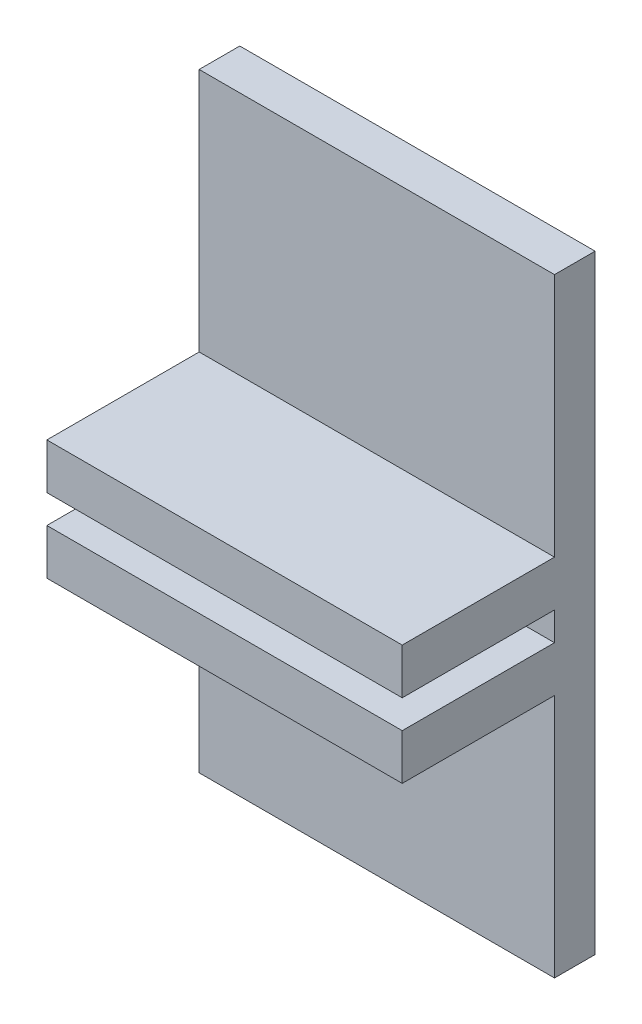
ISO-10303-21;
HEADER;
FILE_DESCRIPTION(('STEP AP214'),'2;1');
FILE_NAME('part.step','',(''),(''),'','','');
FILE_SCHEMA(('AUTOMOTIVE_DESIGN { 1 0 10303 214 1 1 1 1 }'));
ENDSEC;
DATA;
#1=APPLICATION_CONTEXT('core data for automotive mechanical design processes');
#2=APPLICATION_PROTOCOL_DEFINITION('international standard','automotive_design',2000,#1);
#3=PRODUCT_CONTEXT('',#1,'mechanical');
#4=PRODUCT('Part','Part','',(#3));
#5=PRODUCT_RELATED_PRODUCT_CATEGORY('part','',(#4));
#6=PRODUCT_DEFINITION_FORMATION('','',#4);
#7=PRODUCT_DEFINITION_CONTEXT('part definition',#1,'design');
#8=PRODUCT_DEFINITION('design','',#6,#7);
#9=PRODUCT_DEFINITION_SHAPE('','',#8);
#10=(LENGTH_UNIT() NAMED_UNIT(*) SI_UNIT(.MILLI.,.METRE.));
#11=(NAMED_UNIT(*) PLANE_ANGLE_UNIT() SI_UNIT($,.RADIAN.));
#12=(NAMED_UNIT(*) SI_UNIT($,.STERADIAN.) SOLID_ANGLE_UNIT());
#13=UNCERTAINTY_MEASURE_WITH_UNIT(LENGTH_MEASURE(1.E-05),#10,'distance_accuracy_value','');
#14=(GEOMETRIC_REPRESENTATION_CONTEXT(3) GLOBAL_UNCERTAINTY_ASSIGNED_CONTEXT((#13)) GLOBAL_UNIT_ASSIGNED_CONTEXT((#10,
#11,#12)) REPRESENTATION_CONTEXT('',''));
#15=CARTESIAN_POINT('',(0.,0.,0.));
#16=DIRECTION('',(0.,0.,1.));
#17=DIRECTION('',(1.,0.,0.));
#18=AXIS2_PLACEMENT_3D('',#15,#16,#17);
#19=CARTESIAN_POINT('',(-35.,11.8,8.));
#20=DIRECTION('',(0.,1.,0.));
#21=DIRECTION('',(1.,0.,0.));
#22=AXIS2_PLACEMENT_3D('',#19,#20,#21);
#23=PLANE('',#22);
#24=DIRECTION('',(1.,0.,0.));
#25=VECTOR('',#24,1.);
#26=CARTESIAN_POINT('',(-35.,11.8,8.));
#27=LINE('',#26,#25);
#28=CARTESIAN_POINT('',(-35.,11.8,8.));
#29=VERTEX_POINT('',#28);
#30=CARTESIAN_POINT('',(35.,11.8,8.));
#31=VERTEX_POINT('',#30);
#32=EDGE_CURVE('E169',#29,#31,#27,.T.);
#33=ORIENTED_EDGE('',*,*,#32,.F.);
#34=DIRECTION('',(0.,0.,1.));
#35=VECTOR('',#34,1.);
#36=CARTESIAN_POINT('',(-35.,11.8,8.));
#37=LINE('',#36,#35);
#38=CARTESIAN_POINT('',(-35.,11.8,38.));
#39=VERTEX_POINT('',#38);
#40=EDGE_CURVE('E154',#29,#39,#37,.T.);
#41=ORIENTED_EDGE('',*,*,#40,.T.);
#42=DIRECTION('',(1.,0.,0.));
#43=VECTOR('',#42,1.);
#44=CARTESIAN_POINT('',(-35.,11.8,38.));
#45=LINE('',#44,#43);
#46=CARTESIAN_POINT('',(35.,11.8,38.));
#47=VERTEX_POINT('',#46);
#48=EDGE_CURVE('E9',#39,#47,#45,.T.);
#49=ORIENTED_EDGE('',*,*,#48,.T.);
#50=DIRECTION('',(0.,0.,1.));
#51=VECTOR('',#50,1.);
#52=CARTESIAN_POINT('',(35.,11.8,8.));
#53=LINE('',#52,#51);
#54=EDGE_CURVE('E155',#31,#47,#53,.T.);
#55=ORIENTED_EDGE('',*,*,#54,.F.);
#56=EDGE_LOOP('',(#33,#41,#49,#55));
#57=FACE_BOUND('',#56,.T.);
#58=ADVANCED_FACE('F14',(#57),#23,.T.);
#59=CARTESIAN_POINT('',(-35.,2.8,38.));
#60=DIRECTION('',(0.,0.,1.));
#61=DIRECTION('',(1.,0.,0.));
#62=AXIS2_PLACEMENT_3D('',#59,#60,#61);
#63=PLANE('',#62);
#64=DIRECTION('',(0.,1.,0.));
#65=VECTOR('',#64,1.);
#66=CARTESIAN_POINT('',(-35.,2.8,38.));
#67=LINE('',#66,#65);
#68=CARTESIAN_POINT('',(-35.,2.8,38.));
#69=VERTEX_POINT('',#68);
#70=EDGE_CURVE('E225',#69,#39,#67,.T.);
#71=ORIENTED_EDGE('',*,*,#70,.F.);
#72=DIRECTION('',(1.,0.,0.));
#73=VECTOR('',#72,1.);
#74=CARTESIAN_POINT('',(-35.,2.8,38.));
#75=LINE('',#74,#73);
#76=CARTESIAN_POINT('',(35.,2.8,38.));
#77=VERTEX_POINT('',#76);
#78=EDGE_CURVE('E25',#69,#77,#75,.T.);
#79=ORIENTED_EDGE('',*,*,#78,.T.);
#80=DIRECTION('',(0.,1.,0.));
#81=VECTOR('',#80,1.);
#82=CARTESIAN_POINT('',(35.,2.8,38.));
#83=LINE('',#82,#81);
#84=EDGE_CURVE('E159',#77,#47,#83,.T.);
#85=ORIENTED_EDGE('',*,*,#84,.T.);
#86=ORIENTED_EDGE('',*,*,#48,.F.);
#87=EDGE_LOOP('',(#71,#79,#85,#86));
#88=FACE_BOUND('',#87,.T.);
#89=ADVANCED_FACE('F336',(#88),#63,.T.);
#90=CARTESIAN_POINT('',(-35.,2.8,8.));
#91=DIRECTION('',(0.,1.,0.));
#92=DIRECTION('',(1.,0.,0.));
#93=AXIS2_PLACEMENT_3D('',#90,#91,#92);
#94=PLANE('',#93);
#95=DIRECTION('',(0.,0.,1.));
#96=VECTOR('',#95,1.);
#97=CARTESIAN_POINT('',(35.,2.8,8.));
#98=LINE('',#97,#96);
#99=CARTESIAN_POINT('',(35.,2.8,8.));
#100=VERTEX_POINT('',#99);
#101=EDGE_CURVE('E160',#100,#77,#98,.T.);
#102=ORIENTED_EDGE('',*,*,#101,.T.);
#103=ORIENTED_EDGE('',*,*,#78,.F.);
#104=DIRECTION('',(0.,0.,1.));
#105=VECTOR('',#104,1.);
#106=CARTESIAN_POINT('',(-35.,2.8,8.));
#107=LINE('',#106,#105);
#108=CARTESIAN_POINT('',(-35.,2.8,8.));
#109=VERTEX_POINT('',#108);
#110=EDGE_CURVE('E191',#109,#69,#107,.T.);
#111=ORIENTED_EDGE('',*,*,#110,.F.);
#112=DIRECTION('',(1.,0.,0.));
#113=VECTOR('',#112,1.);
#114=CARTESIAN_POINT('',(-35.,2.8,8.));
#115=LINE('',#114,#113);
#116=EDGE_CURVE('E173',#109,#100,#115,.T.);
#117=ORIENTED_EDGE('',*,*,#116,.T.);
#118=EDGE_LOOP('',(#102,#103,#111,#117));
#119=FACE_BOUND('',#118,.T.);
#120=ADVANCED_FACE('F297',(#119),#94,.F.);
#121=CARTESIAN_POINT('',(35.,-60.,0.));
#122=DIRECTION('',(1.,0.,0.));
#123=DIRECTION('',(0.,1.,0.));
#124=AXIS2_PLACEMENT_3D('',#121,#122,#123);
#125=PLANE('',#124);
#126=DIRECTION('',(0.,0.,1.));
#127=VECTOR('',#126,1.);
#128=CARTESIAN_POINT('',(35.,-60.,0.));
#129=LINE('',#128,#127);
#130=CARTESIAN_POINT('',(35.,-60.,0.));
#131=VERTEX_POINT('',#130);
#132=CARTESIAN_POINT('',(35.,-60.,8.));
#133=VERTEX_POINT('',#132);
#134=EDGE_CURVE('E122',#131,#133,#129,.T.);
#135=ORIENTED_EDGE('',*,*,#134,.F.);
#136=DIRECTION('',(0.,1.,0.));
#137=VECTOR('',#136,1.);
#138=CARTESIAN_POINT('',(35.,-60.,0.));
#139=LINE('',#138,#137);
#140=CARTESIAN_POINT('',(35.,60.,0.));
#141=VERTEX_POINT('',#140);
#142=EDGE_CURVE('E106',#131,#141,#139,.T.);
#143=ORIENTED_EDGE('',*,*,#142,.T.);
#144=DIRECTION('',(0.,0.,1.));
#145=VECTOR('',#144,1.);
#146=CARTESIAN_POINT('',(35.,60.,0.));
#147=LINE('',#146,#145);
#148=CARTESIAN_POINT('',(35.,60.,8.));
#149=VERTEX_POINT('',#148);
#150=EDGE_CURVE('E163',#141,#149,#147,.T.);
#151=ORIENTED_EDGE('',*,*,#150,.T.);
#152=DIRECTION('',(0.,1.,0.));
#153=VECTOR('',#152,1.);
#154=CARTESIAN_POINT('',(35.,-60.,8.));
#155=LINE('',#154,#153);
#156=EDGE_CURVE('E167',#31,#149,#155,.T.);
#157=ORIENTED_EDGE('',*,*,#156,.F.);
#158=ORIENTED_EDGE('',*,*,#54,.T.);
#159=ORIENTED_EDGE('',*,*,#84,.F.);
#160=ORIENTED_EDGE('',*,*,#101,.F.);
#161=DIRECTION('',(0.,1.,0.));
#162=VECTOR('',#161,1.);
#163=CARTESIAN_POINT('',(35.,-60.,8.));
#164=LINE('',#163,#162);
#165=CARTESIAN_POINT('',(35.,-2.8,8.));
#166=VERTEX_POINT('',#165);
#167=EDGE_CURVE('E170',#166,#100,#164,.T.);
#168=ORIENTED_EDGE('',*,*,#167,.F.);
#169=DIRECTION('',(0.,0.,1.));
#170=VECTOR('',#169,1.);
#171=CARTESIAN_POINT('',(35.,-2.8,8.));
#172=LINE('',#171,#170);
#173=CARTESIAN_POINT('',(35.,-2.8,38.));
#174=VERTEX_POINT('',#173);
#175=EDGE_CURVE('E144',#166,#174,#172,.T.);
#176=ORIENTED_EDGE('',*,*,#175,.T.);
#177=DIRECTION('',(0.,1.,0.));
#178=VECTOR('',#177,1.);
#179=CARTESIAN_POINT('',(35.,-11.8,38.));
#180=LINE('',#179,#178);
#181=CARTESIAN_POINT('',(35.,-11.8,38.));
#182=VERTEX_POINT('',#181);
#183=EDGE_CURVE('E212',#182,#174,#180,.T.);
#184=ORIENTED_EDGE('',*,*,#183,.F.);
#185=DIRECTION('',(0.,0.,1.));
#186=VECTOR('',#185,1.);
#187=CARTESIAN_POINT('',(35.,-11.8,8.));
#188=LINE('',#187,#186);
#189=CARTESIAN_POINT('',(35.,-11.8,8.));
#190=VERTEX_POINT('',#189);
#191=EDGE_CURVE('E202',#190,#182,#188,.T.);
#192=ORIENTED_EDGE('',*,*,#191,.F.);
#193=DIRECTION('',(0.,1.,0.));
#194=VECTOR('',#193,1.);
#195=CARTESIAN_POINT('',(35.,-60.,8.));
#196=LINE('',#195,#194);
#197=EDGE_CURVE('E131',#133,#190,#196,.T.);
#198=ORIENTED_EDGE('',*,*,#197,.F.);
#199=EDGE_LOOP('',(#135,#143,#151,#157,#158,#159,#160,#168,#176,#184,#192,#198));
#200=FACE_BOUND('',#199,.T.);
#201=ADVANCED_FACE('F129',(#200),#125,.T.);
#202=CARTESIAN_POINT('',(-35.,-60.,8.));
#203=DIRECTION('',(0.,0.,1.));
#204=DIRECTION('',(1.,0.,0.));
#205=AXIS2_PLACEMENT_3D('',#202,#203,#204);
#206=PLANE('',#205);
#207=DIRECTION('',(0.,1.,0.));
#208=VECTOR('',#207,1.);
#209=CARTESIAN_POINT('',(-35.,-60.,8.));
#210=LINE('',#209,#208);
#211=CARTESIAN_POINT('',(-35.,-60.,8.));
#212=VERTEX_POINT('',#211);
#213=CARTESIAN_POINT('',(-35.,-11.8,8.));
#214=VERTEX_POINT('',#213);
#215=EDGE_CURVE('E197',#212,#214,#210,.T.);
#216=ORIENTED_EDGE('',*,*,#215,.F.);
#217=DIRECTION('',(1.,0.,0.));
#218=VECTOR('',#217,1.);
#219=CARTESIAN_POINT('',(-35.,-60.,8.));
#220=LINE('',#219,#218);
#221=EDGE_CURVE('E127',#212,#133,#220,.T.);
#222=ORIENTED_EDGE('',*,*,#221,.T.);
#223=ORIENTED_EDGE('',*,*,#197,.T.);
#224=DIRECTION('',(1.,0.,0.));
#225=VECTOR('',#224,1.);
#226=CARTESIAN_POINT('',(-35.,-11.8,8.));
#227=LINE('',#226,#225);
#228=EDGE_CURVE('E198',#214,#190,#227,.T.);
#229=ORIENTED_EDGE('',*,*,#228,.F.);
#230=EDGE_LOOP('',(#216,#222,#223,#229));
#231=FACE_BOUND('',#230,.T.);
#232=ADVANCED_FACE('F329',(#231),#206,.T.);
#233=CARTESIAN_POINT('',(-35.,-11.8,8.));
#234=DIRECTION('',(0.,1.,0.));
#235=DIRECTION('',(1.,0.,0.));
#236=AXIS2_PLACEMENT_3D('',#233,#234,#235);
#237=PLANE('',#236);
#238=ORIENTED_EDGE('',*,*,#191,.T.);
#239=DIRECTION('',(1.,0.,0.));
#240=VECTOR('',#239,1.);
#241=CARTESIAN_POINT('',(-35.,-11.8,38.));
#242=LINE('',#241,#240);
#243=CARTESIAN_POINT('',(-35.,-11.8,38.));
#244=VERTEX_POINT('',#243);
#245=EDGE_CURVE('E147',#244,#182,#242,.T.);
#246=ORIENTED_EDGE('',*,*,#245,.F.);
#247=DIRECTION('',(0.,0.,1.));
#248=VECTOR('',#247,1.);
#249=CARTESIAN_POINT('',(-35.,-11.8,8.));
#250=LINE('',#249,#248);
#251=EDGE_CURVE('E193',#214,#244,#250,.T.);
#252=ORIENTED_EDGE('',*,*,#251,.F.);
#253=ORIENTED_EDGE('',*,*,#228,.T.);
#254=EDGE_LOOP('',(#238,#246,#252,#253));
#255=FACE_BOUND('',#254,.T.);
#256=ADVANCED_FACE('F274',(#255),#237,.F.);
#257=CARTESIAN_POINT('',(-35.,-11.8,38.));
#258=DIRECTION('',(0.,0.,1.));
#259=DIRECTION('',(1.,0.,0.));
#260=AXIS2_PLACEMENT_3D('',#257,#258,#259);
#261=PLANE('',#260);
#262=DIRECTION('',(0.,1.,0.));
#263=VECTOR('',#262,1.);
#264=CARTESIAN_POINT('',(-35.,-11.8,38.));
#265=LINE('',#264,#263);
#266=CARTESIAN_POINT('',(-35.,-2.8,38.));
#267=VERTEX_POINT('',#266);
#268=EDGE_CURVE('E196',#244,#267,#265,.T.);
#269=ORIENTED_EDGE('',*,*,#268,.F.);
#270=ORIENTED_EDGE('',*,*,#245,.T.);
#271=ORIENTED_EDGE('',*,*,#183,.T.);
#272=DIRECTION('',(1.,0.,0.));
#273=VECTOR('',#272,1.);
#274=CARTESIAN_POINT('',(-35.,-2.8,38.));
#275=LINE('',#274,#273);
#276=EDGE_CURVE('E148',#267,#174,#275,.T.);
#277=ORIENTED_EDGE('',*,*,#276,.F.);
#278=EDGE_LOOP('',(#269,#270,#271,#277));
#279=FACE_BOUND('',#278,.T.);
#280=ADVANCED_FACE('F278',(#279),#261,.T.);
#281=CARTESIAN_POINT('',(-35.,-2.8,8.));
#282=DIRECTION('',(0.,1.,0.));
#283=DIRECTION('',(1.,0.,0.));
#284=AXIS2_PLACEMENT_3D('',#281,#282,#283);
#285=PLANE('',#284);
#286=DIRECTION('',(1.,0.,0.));
#287=VECTOR('',#286,1.);
#288=CARTESIAN_POINT('',(-35.,-2.8,8.));
#289=LINE('',#288,#287);
#290=CARTESIAN_POINT('',(-35.,-2.8,8.));
#291=VERTEX_POINT('',#290);
#292=EDGE_CURVE('E165',#291,#166,#289,.T.);
#293=ORIENTED_EDGE('',*,*,#292,.F.);
#294=DIRECTION('',(0.,0.,1.));
#295=VECTOR('',#294,1.);
#296=CARTESIAN_POINT('',(-35.,-2.8,8.));
#297=LINE('',#296,#295);
#298=EDGE_CURVE('E18',#291,#267,#297,.T.);
#299=ORIENTED_EDGE('',*,*,#298,.T.);
#300=ORIENTED_EDGE('',*,*,#276,.T.);
#301=ORIENTED_EDGE('',*,*,#175,.F.);
#302=EDGE_LOOP('',(#293,#299,#300,#301));
#303=FACE_BOUND('',#302,.T.);
#304=ADVANCED_FACE('F16',(#303),#285,.T.);
#305=CARTESIAN_POINT('',(-35.,-60.,8.));
#306=DIRECTION('',(0.,0.,1.));
#307=DIRECTION('',(1.,0.,0.));
#308=AXIS2_PLACEMENT_3D('',#305,#306,#307);
#309=PLANE('',#308);
#310=DIRECTION('',(0.,1.,0.));
#311=VECTOR('',#310,1.);
#312=CARTESIAN_POINT('',(-35.,-60.,8.));
#313=LINE('',#312,#311);
#314=CARTESIAN_POINT('',(-35.,60.,8.));
#315=VERTEX_POINT('',#314);
#316=EDGE_CURVE('E149',#29,#315,#313,.T.);
#317=ORIENTED_EDGE('',*,*,#316,.F.);
#318=ORIENTED_EDGE('',*,*,#32,.T.);
#319=ORIENTED_EDGE('',*,*,#156,.T.);
#320=DIRECTION('',(1.,0.,0.));
#321=VECTOR('',#320,1.);
#322=CARTESIAN_POINT('',(-35.,60.,8.));
#323=LINE('',#322,#321);
#324=EDGE_CURVE('E117',#315,#149,#323,.T.);
#325=ORIENTED_EDGE('',*,*,#324,.F.);
#326=EDGE_LOOP('',(#317,#318,#319,#325));
#327=FACE_BOUND('',#326,.T.);
#328=ADVANCED_FACE('F243',(#327),#309,.T.);
#329=CARTESIAN_POINT('',(-35.,-60.,8.));
#330=DIRECTION('',(0.,0.,1.));
#331=DIRECTION('',(1.,0.,0.));
#332=AXIS2_PLACEMENT_3D('',#329,#330,#331);
#333=PLANE('',#332);
#334=DIRECTION('',(0.,1.,0.));
#335=VECTOR('',#334,1.);
#336=CARTESIAN_POINT('',(-35.,-60.,8.));
#337=LINE('',#336,#335);
#338=EDGE_CURVE('E219',#291,#109,#337,.T.);
#339=ORIENTED_EDGE('',*,*,#338,.F.);
#340=ORIENTED_EDGE('',*,*,#292,.T.);
#341=ORIENTED_EDGE('',*,*,#167,.T.);
#342=ORIENTED_EDGE('',*,*,#116,.F.);
#343=EDGE_LOOP('',(#339,#340,#341,#342));
#344=FACE_BOUND('',#343,.T.);
#345=ADVANCED_FACE('F299',(#344),#333,.T.);
#346=CARTESIAN_POINT('',(-35.,60.,0.));
#347=DIRECTION('',(0.,1.,0.));
#348=DIRECTION('',(1.,0.,0.));
#349=AXIS2_PLACEMENT_3D('',#346,#347,#348);
#350=PLANE('',#349);
#351=DIRECTION('',(1.,0.,0.));
#352=VECTOR('',#351,1.);
#353=CARTESIAN_POINT('',(-35.,60.,0.));
#354=LINE('',#353,#352);
#355=CARTESIAN_POINT('',(-35.,60.,0.));
#356=VERTEX_POINT('',#355);
#357=EDGE_CURVE('E112',#356,#141,#354,.T.);
#358=ORIENTED_EDGE('',*,*,#357,.F.);
#359=DIRECTION('',(0.,0.,1.));
#360=VECTOR('',#359,1.);
#361=CARTESIAN_POINT('',(-35.,60.,0.));
#362=LINE('',#361,#360);
#363=EDGE_CURVE('E153',#356,#315,#362,.T.);
#364=ORIENTED_EDGE('',*,*,#363,.T.);
#365=ORIENTED_EDGE('',*,*,#324,.T.);
#366=ORIENTED_EDGE('',*,*,#150,.F.);
#367=EDGE_LOOP('',(#358,#364,#365,#366));
#368=FACE_BOUND('',#367,.T.);
#369=ADVANCED_FACE('F307',(#368),#350,.T.);
#370=CARTESIAN_POINT('',(-35.,-60.,0.));
#371=DIRECTION('',(0.,0.,1.));
#372=DIRECTION('',(1.,0.,0.));
#373=AXIS2_PLACEMENT_3D('',#370,#371,#372);
#374=PLANE('',#373);
#375=ORIENTED_EDGE('',*,*,#357,.T.);
#376=ORIENTED_EDGE('',*,*,#142,.F.);
#377=DIRECTION('',(1.,0.,0.));
#378=VECTOR('',#377,1.);
#379=CARTESIAN_POINT('',(-35.,-60.,0.));
#380=LINE('',#379,#378);
#381=CARTESIAN_POINT('',(-35.,-60.,0.));
#382=VERTEX_POINT('',#381);
#383=EDGE_CURVE('E110',#382,#131,#380,.T.);
#384=ORIENTED_EDGE('',*,*,#383,.F.);
#385=DIRECTION('',(0.,1.,0.));
#386=VECTOR('',#385,1.);
#387=CARTESIAN_POINT('',(-35.,-60.,0.));
#388=LINE('',#387,#386);
#389=EDGE_CURVE('E140',#382,#356,#388,.T.);
#390=ORIENTED_EDGE('',*,*,#389,.T.);
#391=EDGE_LOOP('',(#375,#376,#384,#390));
#392=FACE_BOUND('',#391,.T.);
#393=ADVANCED_FACE('F108',(#392),#374,.F.);
#394=CARTESIAN_POINT('',(-35.,-60.,0.));
#395=DIRECTION('',(0.,1.,0.));
#396=DIRECTION('',(1.,0.,0.));
#397=AXIS2_PLACEMENT_3D('',#394,#395,#396);
#398=PLANE('',#397);
#399=ORIENTED_EDGE('',*,*,#134,.T.);
#400=ORIENTED_EDGE('',*,*,#221,.F.);
#401=DIRECTION('',(0.,0.,1.));
#402=VECTOR('',#401,1.);
#403=CARTESIAN_POINT('',(-35.,-60.,0.));
#404=LINE('',#403,#402);
#405=EDGE_CURVE('E124',#382,#212,#404,.T.);
#406=ORIENTED_EDGE('',*,*,#405,.F.);
#407=ORIENTED_EDGE('',*,*,#383,.T.);
#408=EDGE_LOOP('',(#399,#400,#406,#407));
#409=FACE_BOUND('',#408,.T.);
#410=ADVANCED_FACE('F121',(#409),#398,.F.);
#411=CARTESIAN_POINT('',(-35.,-60.,0.));
#412=DIRECTION('',(1.,0.,0.));
#413=DIRECTION('',(0.,1.,0.));
#414=AXIS2_PLACEMENT_3D('',#411,#412,#413);
#415=PLANE('',#414);
#416=ORIENTED_EDGE('',*,*,#215,.T.);
#417=ORIENTED_EDGE('',*,*,#251,.T.);
#418=ORIENTED_EDGE('',*,*,#268,.T.);
#419=ORIENTED_EDGE('',*,*,#298,.F.);
#420=ORIENTED_EDGE('',*,*,#338,.T.);
#421=ORIENTED_EDGE('',*,*,#110,.T.);
#422=ORIENTED_EDGE('',*,*,#70,.T.);
#423=ORIENTED_EDGE('',*,*,#40,.F.);
#424=ORIENTED_EDGE('',*,*,#316,.T.);
#425=ORIENTED_EDGE('',*,*,#363,.F.);
#426=ORIENTED_EDGE('',*,*,#389,.F.);
#427=ORIENTED_EDGE('',*,*,#405,.T.);
#428=EDGE_LOOP('',(#416,#417,#418,#419,#420,#421,#422,#423,#424,#425,#426,#427));
#429=FACE_BOUND('',#428,.T.);
#430=ADVANCED_FACE('F283',(#429),#415,.F.);
#431=CLOSED_SHELL('',(#58,#89,#120,#201,#232,#256,#280,#304,#328,#345,#369,#393,#410,#430));
#432=MANIFOLD_SOLID_BREP('B1',#431);
#433=ADVANCED_BREP_SHAPE_REPRESENTATION('',(#18,#432),#14);
#434=SHAPE_DEFINITION_REPRESENTATION(#9,#433);
ENDSEC;
END-ISO-10303-21;
